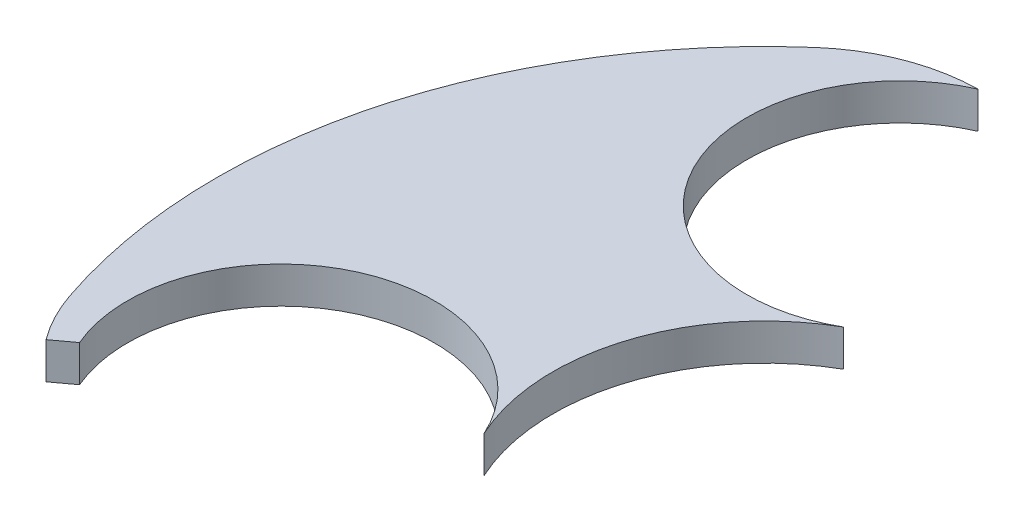
ISO-10303-21;
HEADER;
FILE_DESCRIPTION(('STEP AP214'),'2;1');
FILE_NAME('part.step','',(''),(''),'','','');
FILE_SCHEMA(('AUTOMOTIVE_DESIGN { 1 0 10303 214 1 1 1 1 }'));
ENDSEC;
DATA;
#1=APPLICATION_CONTEXT('core data for automotive mechanical design processes');
#2=APPLICATION_PROTOCOL_DEFINITION('international standard','automotive_design',2000,#1);
#3=PRODUCT_CONTEXT('',#1,'mechanical');
#4=PRODUCT('Part','Part','',(#3));
#5=PRODUCT_RELATED_PRODUCT_CATEGORY('part','',(#4));
#6=PRODUCT_DEFINITION_FORMATION('','',#4);
#7=PRODUCT_DEFINITION_CONTEXT('part definition',#1,'design');
#8=PRODUCT_DEFINITION('design','',#6,#7);
#9=PRODUCT_DEFINITION_SHAPE('','',#8);
#10=(LENGTH_UNIT() NAMED_UNIT(*) SI_UNIT(.MILLI.,.METRE.));
#11=(NAMED_UNIT(*) PLANE_ANGLE_UNIT() SI_UNIT($,.RADIAN.));
#12=(NAMED_UNIT(*) SI_UNIT($,.STERADIAN.) SOLID_ANGLE_UNIT());
#13=UNCERTAINTY_MEASURE_WITH_UNIT(LENGTH_MEASURE(1.E-05),#10,'distance_accuracy_value','');
#14=(GEOMETRIC_REPRESENTATION_CONTEXT(3) GLOBAL_UNCERTAINTY_ASSIGNED_CONTEXT((#13)) GLOBAL_UNIT_ASSIGNED_CONTEXT((#10,
#11,#12)) REPRESENTATION_CONTEXT('',''));
#15=CARTESIAN_POINT('',(0.,0.,0.));
#16=DIRECTION('',(0.,0.,1.));
#17=DIRECTION('',(1.,0.,0.));
#18=AXIS2_PLACEMENT_3D('',#15,#16,#17);
#19=CARTESIAN_POINT('',(-62.5009039730179,5.,34.6421467061882));
#20=DIRECTION('',(0.,-1.,0.));
#21=DIRECTION('',(0.,0.,-1.));
#22=AXIS2_PLACEMENT_3D('',#19,#20,#21);
#23=CYLINDRICAL_SURFACE('',#22,21.);
#24=CARTESIAN_POINT('',(-62.5009039730179,0.,34.6421467061882));
#25=DIRECTION('',(0.,1.,0.));
#26=DIRECTION('',(0.,0.,1.));
#27=AXIS2_PLACEMENT_3D('',#24,#25,#26);
#28=CIRCLE('',#27,21.);
#29=CARTESIAN_POINT('',(-43.3840908993793,0.,25.9503426410035));
#30=VERTEX_POINT('',#29);
#31=CARTESIAN_POINT('',(-81.8158424390767,0.,42.8843037085972));
#32=VERTEX_POINT('',#31);
#33=EDGE_CURVE('E122',#30,#32,#28,.T.);
#34=ORIENTED_EDGE('',*,*,#33,.F.);
#35=DIRECTION('',(0.,-1.,0.));
#36=VECTOR('',#35,1.);
#37=CARTESIAN_POINT('',(-43.3840908993793,5.,25.9503426410035));
#38=LINE('',#37,#36);
#39=CARTESIAN_POINT('',(-43.3840908993793,5.,25.9503426410035));
#40=VERTEX_POINT('',#39);
#41=EDGE_CURVE('E11',#40,#30,#38,.T.);
#42=ORIENTED_EDGE('',*,*,#41,.F.);
#43=CARTESIAN_POINT('',(-62.5009039730179,5.,34.6421467061882));
#44=DIRECTION('',(0.,1.,0.));
#45=DIRECTION('',(0.,0.,1.));
#46=AXIS2_PLACEMENT_3D('',#43,#44,#45);
#47=CIRCLE('',#46,21.);
#48=CARTESIAN_POINT('',(-81.8158424390767,5.,42.8843037085972));
#49=VERTEX_POINT('',#48);
#50=EDGE_CURVE('E137',#40,#49,#47,.T.);
#51=ORIENTED_EDGE('',*,*,#50,.T.);
#52=DIRECTION('',(0.,-1.,0.));
#53=VECTOR('',#52,1.);
#54=CARTESIAN_POINT('',(-81.8158424390767,5.,42.8843037085972));
#55=LINE('',#54,#53);
#56=EDGE_CURVE('E83',#49,#32,#55,.T.);
#57=ORIENTED_EDGE('',*,*,#56,.T.);
#58=EDGE_LOOP('',(#34,#42,#51,#57));
#59=FACE_BOUND('',#58,.T.);
#60=ADVANCED_FACE('F35',(#59),#23,.F.);
#61=CARTESIAN_POINT('',(-16.9846823691165,5.,13.9473751224152));
#62=DIRECTION('',(0.,-1.,0.));
#63=DIRECTION('',(0.,0.,-1.));
#64=AXIS2_PLACEMENT_3D('',#61,#62,#63);
#65=CYLINDRICAL_SURFACE('',#64,29.);
#66=CARTESIAN_POINT('',(-16.9846823691165,0.,13.9473751224152));
#67=DIRECTION('',(0.,1.,0.));
#68=DIRECTION('',(0.,0.,1.));
#69=AXIS2_PLACEMENT_3D('',#66,#67,#68);
#70=CIRCLE('',#69,29.);
#71=CARTESIAN_POINT('',(-31.3986187192387,0.,-11.2168542298742));
#72=VERTEX_POINT('',#71);
#73=EDGE_CURVE('E125',#72,#30,#70,.T.);
#74=ORIENTED_EDGE('',*,*,#73,.F.);
#75=DIRECTION('',(0.,-1.,0.));
#76=VECTOR('',#75,1.);
#77=CARTESIAN_POINT('',(-31.3986187192387,5.,-11.2168542298742));
#78=LINE('',#77,#76);
#79=CARTESIAN_POINT('',(-31.3986187192387,5.,-11.2168542298742));
#80=VERTEX_POINT('',#79);
#81=EDGE_CURVE('E43',#80,#72,#78,.T.);
#82=ORIENTED_EDGE('',*,*,#81,.F.);
#83=CARTESIAN_POINT('',(-16.9846823691165,5.,13.9473751224152));
#84=DIRECTION('',(0.,1.,0.));
#85=DIRECTION('',(0.,0.,1.));
#86=AXIS2_PLACEMENT_3D('',#83,#84,#85);
#87=CIRCLE('',#86,29.);
#88=EDGE_CURVE('E157',#80,#40,#87,.T.);
#89=ORIENTED_EDGE('',*,*,#88,.T.);
#90=ORIENTED_EDGE('',*,*,#41,.T.);
#91=EDGE_LOOP('',(#74,#82,#89,#90));
#92=FACE_BOUND('',#91,.T.);
#93=ADVANCED_FACE('F151',(#92),#65,.F.);
#94=CARTESIAN_POINT('',(-41.836296765879,5.,-29.4392272091183));
#95=DIRECTION('',(0.,-1.,0.));
#96=DIRECTION('',(0.,0.,-1.));
#97=AXIS2_PLACEMENT_3D('',#94,#95,#96);
#98=CYLINDRICAL_SURFACE('',#97,21.);
#99=CARTESIAN_POINT('',(-41.836296765879,0.,-29.4392272091183));
#100=DIRECTION('',(0.,1.,0.));
#101=DIRECTION('',(0.,0.,1.));
#102=AXIS2_PLACEMENT_3D('',#99,#100,#101);
#103=CIRCLE('',#102,21.);
#104=CARTESIAN_POINT('',(-50.3797961938972,0.,-48.6227779107859));
#105=VERTEX_POINT('',#104);
#106=EDGE_CURVE('E128',#105,#72,#103,.T.);
#107=ORIENTED_EDGE('',*,*,#106,.F.);
#108=DIRECTION('',(0.,-1.,0.));
#109=VECTOR('',#108,1.);
#110=CARTESIAN_POINT('',(-50.3797961938972,5.,-48.6227779107859));
#111=LINE('',#110,#109);
#112=CARTESIAN_POINT('',(-50.3797961938972,5.,-48.6227779107859));
#113=VERTEX_POINT('',#112);
#114=EDGE_CURVE('E141',#113,#105,#111,.T.);
#115=ORIENTED_EDGE('',*,*,#114,.F.);
#116=CARTESIAN_POINT('',(-41.836296765879,5.,-29.4392272091183));
#117=DIRECTION('',(0.,1.,0.));
#118=DIRECTION('',(0.,0.,1.));
#119=AXIS2_PLACEMENT_3D('',#116,#117,#118);
#120=CIRCLE('',#119,21.);
#121=EDGE_CURVE('E147',#113,#80,#120,.T.);
#122=ORIENTED_EDGE('',*,*,#121,.T.);
#123=ORIENTED_EDGE('',*,*,#81,.T.);
#124=EDGE_LOOP('',(#107,#115,#122,#123));
#125=FACE_BOUND('',#124,.T.);
#126=ADVANCED_FACE('F146',(#125),#98,.F.);
#127=CARTESIAN_POINT('',(-49.9730893296671,5.,-23.6260863391683));
#128=DIRECTION('',(0.,-1.,0.));
#129=DIRECTION('',(0.,0.,-1.));
#130=AXIS2_PLACEMENT_3D('',#127,#128,#129);
#131=CYLINDRICAL_SURFACE('',#130,25.);
#132=CARTESIAN_POINT('',(-49.9730893296671,0.,-23.6260863391683));
#133=DIRECTION('',(0.,1.,0.));
#134=DIRECTION('',(0.,0.,1.));
#135=AXIS2_PLACEMENT_3D('',#132,#133,#134);
#136=CIRCLE('',#135,25.);
#137=CARTESIAN_POINT('',(-66.4672928099424,0.,-42.4128170699601));
#138=VERTEX_POINT('',#137);
#139=EDGE_CURVE('E131',#105,#138,#136,.T.);
#140=ORIENTED_EDGE('',*,*,#139,.T.);
#141=DIRECTION('',(0.,-1.,0.));
#142=VECTOR('',#141,1.);
#143=CARTESIAN_POINT('',(-66.4672928099424,5.,-42.4128170699601));
#144=LINE('',#143,#142);
#145=CARTESIAN_POINT('',(-66.4672928099424,5.,-42.4128170699601));
#146=VERTEX_POINT('',#145);
#147=EDGE_CURVE('E114',#146,#138,#144,.T.);
#148=ORIENTED_EDGE('',*,*,#147,.F.);
#149=CARTESIAN_POINT('',(-49.9730893296671,5.,-23.6260863391683));
#150=DIRECTION('',(0.,1.,0.));
#151=DIRECTION('',(0.,0.,1.));
#152=AXIS2_PLACEMENT_3D('',#149,#150,#151);
#153=CIRCLE('',#152,25.);
#154=EDGE_CURVE('E105',#113,#146,#153,.T.);
#155=ORIENTED_EDGE('',*,*,#154,.F.);
#156=ORIENTED_EDGE('',*,*,#114,.T.);
#157=EDGE_LOOP('',(#140,#148,#155,#156));
#158=FACE_BOUND('',#157,.T.);
#159=ADVANCED_FACE('F156',(#158),#131,.T.);
#160=CARTESIAN_POINT('',(-16.9846823691165,5.,13.9473751224152));
#161=DIRECTION('',(0.,-1.,0.));
#162=DIRECTION('',(0.,0.,-1.));
#163=AXIS2_PLACEMENT_3D('',#160,#161,#162);
#164=CYLINDRICAL_SURFACE('',#163,75.);
#165=CARTESIAN_POINT('',(-16.9846823691165,0.,13.9473751224152));
#166=DIRECTION('',(0.,1.,0.));
#167=DIRECTION('',(0.,0.,1.));
#168=AXIS2_PLACEMENT_3D('',#165,#166,#167);
#169=CIRCLE('',#168,75.);
#170=CARTESIAN_POINT('',(-88.0179761526286,0.,38.0154281027719));
#171=VERTEX_POINT('',#170);
#172=EDGE_CURVE('E113',#138,#171,#169,.T.);
#173=ORIENTED_EDGE('',*,*,#172,.T.);
#174=DIRECTION('',(0.,-1.,0.));
#175=VECTOR('',#174,1.);
#176=CARTESIAN_POINT('',(-88.0179761526286,5.,38.0154281027719));
#177=LINE('',#176,#175);
#178=CARTESIAN_POINT('',(-88.0179761526286,5.,38.0154281027719));
#179=VERTEX_POINT('',#178);
#180=EDGE_CURVE('E110',#179,#171,#177,.T.);
#181=ORIENTED_EDGE('',*,*,#180,.F.);
#182=CARTESIAN_POINT('',(-16.9846823691165,5.,13.9473751224152));
#183=DIRECTION('',(0.,1.,0.));
#184=DIRECTION('',(0.,0.,1.));
#185=AXIS2_PLACEMENT_3D('',#182,#183,#184);
#186=CIRCLE('',#185,75.);
#187=EDGE_CURVE('E98',#146,#179,#186,.T.);
#188=ORIENTED_EDGE('',*,*,#187,.F.);
#189=ORIENTED_EDGE('',*,*,#147,.T.);
#190=EDGE_LOOP('',(#173,#181,#188,#189));
#191=FACE_BOUND('',#190,.T.);
#192=ADVANCED_FACE('F111',(#191),#164,.T.);
#193=CARTESIAN_POINT('',(-64.3402115581245,5.,29.9927437759863));
#194=DIRECTION('',(0.,-1.,0.));
#195=DIRECTION('',(0.,0.,-1.));
#196=AXIS2_PLACEMENT_3D('',#193,#194,#195);
#197=CYLINDRICAL_SURFACE('',#196,25.);
#198=CARTESIAN_POINT('',(-64.3402115581245,0.,29.9927437759863));
#199=DIRECTION('',(0.,1.,0.));
#200=DIRECTION('',(0.,0.,1.));
#201=AXIS2_PLACEMENT_3D('',#198,#199,#200);
#202=CIRCLE('',#201,25.);
#203=CARTESIAN_POINT('',(-84.4584792059973,0.,44.833744646836));
#204=VERTEX_POINT('',#203);
#205=EDGE_CURVE('E76',#171,#204,#202,.T.);
#206=ORIENTED_EDGE('',*,*,#205,.T.);
#207=DIRECTION('',(0.,-1.,0.));
#208=VECTOR('',#207,1.);
#209=CARTESIAN_POINT('',(-84.4584792059973,5.,44.833744646836));
#210=LINE('',#209,#208);
#211=CARTESIAN_POINT('',(-84.4584792059973,5.,44.833744646836));
#212=VERTEX_POINT('',#211);
#213=EDGE_CURVE('E115',#212,#204,#210,.T.);
#214=ORIENTED_EDGE('',*,*,#213,.F.);
#215=CARTESIAN_POINT('',(-64.3402115581245,5.,29.9927437759863));
#216=DIRECTION('',(0.,1.,0.));
#217=DIRECTION('',(0.,0.,1.));
#218=AXIS2_PLACEMENT_3D('',#215,#216,#217);
#219=CIRCLE('',#218,25.);
#220=EDGE_CURVE('E102',#179,#212,#219,.T.);
#221=ORIENTED_EDGE('',*,*,#220,.F.);
#222=ORIENTED_EDGE('',*,*,#180,.T.);
#223=EDGE_LOOP('',(#206,#214,#221,#222));
#224=FACE_BOUND('',#223,.T.);
#225=ADVANCED_FACE('F117',(#224),#197,.T.);
#226=CARTESIAN_POINT('',(-8.3458923803376,5.,-11.3135831019166));
#227=DIRECTION('',(-0.593640034833985,0.,-0.804730705914907));
#228=DIRECTION('',(-0.804730705914907,0.,0.593640034833985));
#229=AXIS2_PLACEMENT_3D('',#226,#227,#228);
#230=PLANE('',#229);
#231=DIRECTION('',(0.804730705914907,0.,-0.593640034833985));
#232=VECTOR('',#231,1.);
#233=CARTESIAN_POINT('',(-8.3458923803376,0.,-11.3135831019166));
#234=LINE('',#233,#232);
#235=EDGE_CURVE('E135',#204,#32,#234,.T.);
#236=ORIENTED_EDGE('',*,*,#235,.T.);
#237=ORIENTED_EDGE('',*,*,#56,.F.);
#238=DIRECTION('',(0.804730705914907,0.,-0.593640034833985));
#239=VECTOR('',#238,1.);
#240=CARTESIAN_POINT('',(-8.3458923803376,5.,-11.3135831019166));
#241=LINE('',#240,#239);
#242=EDGE_CURVE('E51',#212,#49,#241,.T.);
#243=ORIENTED_EDGE('',*,*,#242,.F.);
#244=ORIENTED_EDGE('',*,*,#213,.T.);
#245=EDGE_LOOP('',(#236,#237,#243,#244));
#246=FACE_BOUND('',#245,.T.);
#247=ADVANCED_FACE('F176',(#246),#230,.F.);
#248=CARTESIAN_POINT('',(0.,5.,0.));
#249=DIRECTION('',(0.,1.,0.));
#250=DIRECTION('',(0.,0.,1.));
#251=AXIS2_PLACEMENT_3D('',#248,#249,#250);
#252=PLANE('',#251);
#253=ORIENTED_EDGE('',*,*,#50,.F.);
#254=ORIENTED_EDGE('',*,*,#88,.F.);
#255=ORIENTED_EDGE('',*,*,#121,.F.);
#256=ORIENTED_EDGE('',*,*,#154,.T.);
#257=ORIENTED_EDGE('',*,*,#187,.T.);
#258=ORIENTED_EDGE('',*,*,#220,.T.);
#259=ORIENTED_EDGE('',*,*,#242,.T.);
#260=EDGE_LOOP('',(#253,#254,#255,#256,#257,#258,#259));
#261=FACE_BOUND('',#260,.T.);
#262=ADVANCED_FACE('F100',(#261),#252,.T.);
#263=CARTESIAN_POINT('',(0.,0.,0.));
#264=DIRECTION('',(0.,1.,0.));
#265=DIRECTION('',(0.,0.,1.));
#266=AXIS2_PLACEMENT_3D('',#263,#264,#265);
#267=PLANE('',#266);
#268=ORIENTED_EDGE('',*,*,#33,.T.);
#269=ORIENTED_EDGE('',*,*,#235,.F.);
#270=ORIENTED_EDGE('',*,*,#205,.F.);
#271=ORIENTED_EDGE('',*,*,#172,.F.);
#272=ORIENTED_EDGE('',*,*,#139,.F.);
#273=ORIENTED_EDGE('',*,*,#106,.T.);
#274=ORIENTED_EDGE('',*,*,#73,.T.);
#275=EDGE_LOOP('',(#268,#269,#270,#271,#272,#273,#274));
#276=FACE_BOUND('',#275,.T.);
#277=ADVANCED_FACE('F154',(#276),#267,.F.);
#278=CLOSED_SHELL('',(#60,#93,#126,#159,#192,#225,#247,#262,#277));
#279=MANIFOLD_SOLID_BREP('B2',#278);
#280=ADVANCED_BREP_SHAPE_REPRESENTATION('',(#18,#279),#14);
#281=SHAPE_DEFINITION_REPRESENTATION(#9,#280);
ENDSEC;
END-ISO-10303-21;
